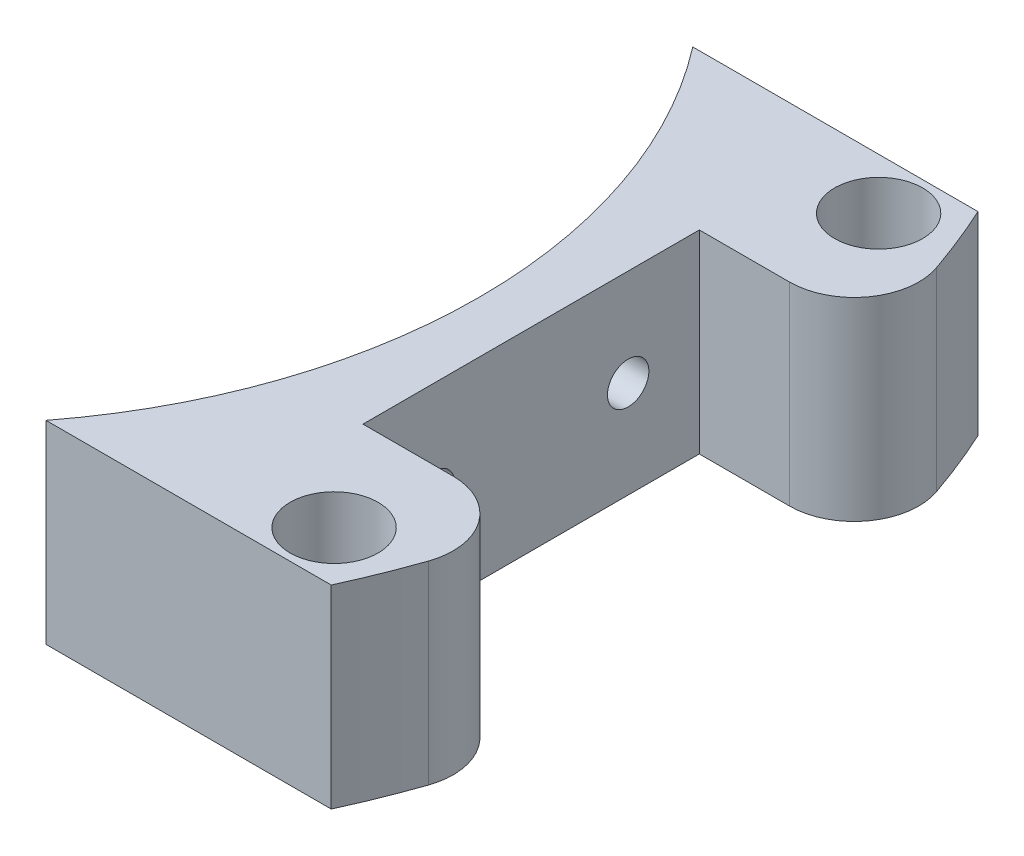
ISO-10303-21;
HEADER;
FILE_DESCRIPTION(('STEP AP214'),'2;1');
FILE_NAME('part.step','',(''),(''),'','','');
FILE_SCHEMA(('AUTOMOTIVE_DESIGN { 1 0 10303 214 1 1 1 1 }'));
ENDSEC;
DATA;
#1=APPLICATION_CONTEXT('core data for automotive mechanical design processes');
#2=APPLICATION_PROTOCOL_DEFINITION('international standard','automotive_design',2000,#1);
#3=PRODUCT_CONTEXT('',#1,'mechanical');
#4=PRODUCT('Part','Part','',(#3));
#5=PRODUCT_RELATED_PRODUCT_CATEGORY('part','',(#4));
#6=PRODUCT_DEFINITION_FORMATION('','',#4);
#7=PRODUCT_DEFINITION_CONTEXT('part definition',#1,'design');
#8=PRODUCT_DEFINITION('design','',#6,#7);
#9=PRODUCT_DEFINITION_SHAPE('','',#8);
#10=(LENGTH_UNIT() NAMED_UNIT(*) SI_UNIT(.MILLI.,.METRE.));
#11=(NAMED_UNIT(*) PLANE_ANGLE_UNIT() SI_UNIT($,.RADIAN.));
#12=(NAMED_UNIT(*) SI_UNIT($,.STERADIAN.) SOLID_ANGLE_UNIT());
#13=UNCERTAINTY_MEASURE_WITH_UNIT(LENGTH_MEASURE(1.E-05),#10,'distance_accuracy_value','');
#14=(GEOMETRIC_REPRESENTATION_CONTEXT(3) GLOBAL_UNCERTAINTY_ASSIGNED_CONTEXT((#13)) GLOBAL_UNIT_ASSIGNED_CONTEXT((#10,
#11,#12)) REPRESENTATION_CONTEXT('',''));
#15=CARTESIAN_POINT('',(0.,0.,0.));
#16=DIRECTION('',(0.,0.,1.));
#17=DIRECTION('',(1.,0.,0.));
#18=AXIS2_PLACEMENT_3D('',#15,#16,#17);
#19=CARTESIAN_POINT('',(-7.95357838980362,7.5,-68.2096969177125));
#20=DIRECTION('',(1.,0.,0.));
#21=DIRECTION('',(0.,0.,-1.));
#22=AXIS2_PLACEMENT_3D('',#19,#20,#21);
#23=CYLINDRICAL_SURFACE('',#22,1.6);
#24=CARTESIAN_POINT('',(4.55026799165255,7.5,-68.2096969177125));
#25=DIRECTION('',(1.,0.,0.));
#26=DIRECTION('',(0.,0.,-1.));
#27=AXIS2_PLACEMENT_3D('',#24,#25,#26);
#28=CIRCLE('',#27,1.6);
#29=CARTESIAN_POINT('',(4.55026799165255,7.5,-69.8096969177125));
#30=VERTEX_POINT('',#29);
#31=EDGE_CURVE('E537',#30,#30,#28,.T.);
#32=CARTESIAN_POINT('',(2.04642161019638,7.5,-68.2096969177125));
#33=DIRECTION('',(-1.,0.,0.));
#34=DIRECTION('',(0.,0.,1.));
#35=AXIS2_PLACEMENT_3D('',#32,#33,#34);
#36=CIRCLE('',#35,1.6);
#37=CARTESIAN_POINT('',(2.04642161019638,7.5,-69.8096969177125));
#38=VERTEX_POINT('',#37);
#39=EDGE_CURVE('E525',#38,#38,#36,.T.);
#40=CARTESIAN_POINT('',(4.55026799165255,7.5,-69.8096969177125));
#41=CARTESIAN_POINT('',(4.52418625851238,7.5,-69.8096969177125));
#42=CARTESIAN_POINT('',(4.49810452537221,7.5,-69.8096969177125));
#43=CARTESIAN_POINT('',(4.44594105909187,7.5,-69.8096969177125));
#44=CARTESIAN_POINT('',(4.4198593259517,7.5,-69.8096969177125));
#45=CARTESIAN_POINT('',(4.36769585967137,7.5,-69.8096969177125));
#46=CARTESIAN_POINT('',(4.3416141265312,7.5,-69.8096969177125));
#47=CARTESIAN_POINT('',(4.28945066025086,7.5,-69.8096969177125));
#48=CARTESIAN_POINT('',(4.26336892711069,7.5,-69.8096969177125));
#49=CARTESIAN_POINT('',(4.21120546083036,7.5,-69.8096969177125));
#50=CARTESIAN_POINT('',(4.18512372769019,7.5,-69.8096969177125));
#51=CARTESIAN_POINT('',(4.13296026140985,7.5,-69.8096969177125));
#52=CARTESIAN_POINT('',(4.10687852826968,7.5,-69.8096969177125));
#53=CARTESIAN_POINT('',(4.05471506198935,7.5,-69.8096969177125));
#54=CARTESIAN_POINT('',(4.02863332884918,7.5,-69.8096969177125));
#55=CARTESIAN_POINT('',(3.97646986256884,7.5,-69.8096969177125));
#56=CARTESIAN_POINT('',(3.95038812942867,7.5,-69.8096969177125));
#57=CARTESIAN_POINT('',(3.89822466314834,7.5,-69.8096969177125));
#58=CARTESIAN_POINT('',(3.87214293000817,7.5,-69.8096969177125));
#59=CARTESIAN_POINT('',(3.81997946372783,7.5,-69.8096969177125));
#60=CARTESIAN_POINT('',(3.79389773058766,7.5,-69.8096969177125));
#61=CARTESIAN_POINT('',(3.74173426430732,7.5,-69.8096969177125));
#62=CARTESIAN_POINT('',(3.71565253116716,7.5,-69.8096969177125));
#63=CARTESIAN_POINT('',(3.66348906488682,7.5,-69.8096969177125));
#64=CARTESIAN_POINT('',(3.63740733174665,7.5,-69.8096969177125));
#65=CARTESIAN_POINT('',(3.58524386546632,7.5,-69.8096969177125));
#66=CARTESIAN_POINT('',(3.55916213232615,7.5,-69.8096969177125));
#67=CARTESIAN_POINT('',(3.50699866604581,7.5,-69.8096969177125));
#68=CARTESIAN_POINT('',(3.48091693290564,7.5,-69.8096969177125));
#69=CARTESIAN_POINT('',(3.4287534666253,7.5,-69.8096969177125));
#70=CARTESIAN_POINT('',(3.40267173348514,7.5,-69.8096969177125));
#71=CARTESIAN_POINT('',(3.3505082672048,7.5,-69.8096969177125));
#72=CARTESIAN_POINT('',(3.32442653406463,7.5,-69.8096969177125));
#73=CARTESIAN_POINT('',(3.27226306778429,7.5,-69.8096969177125));
#74=CARTESIAN_POINT('',(3.24618133464413,7.5,-69.8096969177125));
#75=CARTESIAN_POINT('',(3.19401786836379,7.5,-69.8096969177125));
#76=CARTESIAN_POINT('',(3.16793613522362,7.5,-69.8096969177125));
#77=CARTESIAN_POINT('',(3.11577266894328,7.5,-69.8096969177125));
#78=CARTESIAN_POINT('',(3.08969093580311,7.5,-69.8096969177125));
#79=CARTESIAN_POINT('',(3.03752746952278,7.5,-69.8096969177125));
#80=CARTESIAN_POINT('',(3.01144573638261,7.5,-69.8096969177125));
#81=CARTESIAN_POINT('',(2.95928227010227,7.5,-69.8096969177125));
#82=CARTESIAN_POINT('',(2.9332005369621,7.5,-69.8096969177125));
#83=CARTESIAN_POINT('',(2.88103707068177,7.5,-69.8096969177125));
#84=CARTESIAN_POINT('',(2.8549553375416,7.5,-69.8096969177125));
#85=CARTESIAN_POINT('',(2.80279187126126,7.5,-69.8096969177125));
#86=CARTESIAN_POINT('',(2.77671013812109,7.5,-69.8096969177125));
#87=CARTESIAN_POINT('',(2.72454667184076,7.5,-69.8096969177125));
#88=CARTESIAN_POINT('',(2.69846493870059,7.5,-69.8096969177125));
#89=CARTESIAN_POINT('',(2.64630147242025,7.5,-69.8096969177125));
#90=CARTESIAN_POINT('',(2.62021973928008,7.5,-69.8096969177125));
#91=CARTESIAN_POINT('',(2.56805627299975,7.5,-69.8096969177125));
#92=CARTESIAN_POINT('',(2.54197453985958,7.5,-69.8096969177125));
#93=CARTESIAN_POINT('',(2.48981107357924,7.5,-69.8096969177125));
#94=CARTESIAN_POINT('',(2.46372934043907,7.5,-69.8096969177125));
#95=CARTESIAN_POINT('',(2.41156587415874,7.5,-69.8096969177125));
#96=CARTESIAN_POINT('',(2.38548414101857,7.5,-69.8096969177125));
#97=CARTESIAN_POINT('',(2.33332067473823,7.5,-69.8096969177125));
#98=CARTESIAN_POINT('',(2.30723894159806,7.5,-69.8096969177125));
#99=CARTESIAN_POINT('',(2.25507547531773,7.5,-69.8096969177125));
#100=CARTESIAN_POINT('',(2.22899374217756,7.5,-69.8096969177125));
#101=CARTESIAN_POINT('',(2.17683027589722,7.5,-69.8096969177125));
#102=CARTESIAN_POINT('',(2.15074854275705,7.5,-69.8096969177125));
#103=CARTESIAN_POINT('',(2.09858507647671,7.5,-69.8096969177125));
#104=CARTESIAN_POINT('',(2.07250334333655,7.5,-69.8096969177125));
#105=CARTESIAN_POINT('',(2.04642161019638,7.5,-69.8096969177125));
#106=B_SPLINE_CURVE_WITH_KNOTS('',3,(#40,#41,#42,#43,#44,#45,#46,#47,#48,#49,#50,#51,#52,#53,
#54,#55,#56,#57,#58,#59,#60,#61,#62,#63,#64,#65,#66,#67,#68,#69,#70,#71,#72,#73,#74,#75,#76,#77,
#78,#79,#80,#81,#82,#83,#84,#85,#86,#87,#88,#89,#90,#91,#92,#93,#94,#95,#96,#97,#98,#99,#100,
#101,#102,#103,#104,#105),.UNSPECIFIED.,.F.,.F.,(4,2,2,2,2,2,2,2,2,2,2,2,2,2,2,2,2,2,2,2,2,2,2,
2,2,2,2,2,2,2,2,2,4),(0.,0.0782451994205055,0.156490398841011,0.234735598261517,
0.312980797682022,0.391225997102526,0.469471196523031,0.547716395943537,0.625961595364042,
0.704206794784548,0.782451994205053,0.860697193625559,0.938942393046063,1.01718759246657,
1.09543279188707,1.17367799130758,1.25192319072808,1.33016839014859,1.4084135895691,
1.4866587889896,1.56490398841011,1.64314918783061,1.72139438725112,1.79963958667162,
1.87788478609213,1.95612998551263,2.03437518493314,2.11262038435364,2.19086558377415,
2.26911078319465,2.34735598261516,2.42560118203566,2.50384638145617),.UNSPECIFIED.);
#107=EDGE_CURVE('BSEAM45',#30,#38,#106,.T.);
#108=ORIENTED_EDGE('',*,*,#31,.T.);
#109=ORIENTED_EDGE('',*,*,#39,.T.);
#110=ORIENTED_EDGE('',*,*,#107,.T.);
#111=ORIENTED_EDGE('',*,*,#107,.F.);
#112=EDGE_LOOP('',(#108,#110,#109,#111));
#113=FACE_BOUND('',#112,.T.);
#114=ADVANCED_FACE('F45',(#113),#23,.F.);
#115=CARTESIAN_POINT('',(-7.95357838980362,7.5,-83.2096969177125));
#116=DIRECTION('',(1.,0.,0.));
#117=DIRECTION('',(0.,0.,-1.));
#118=AXIS2_PLACEMENT_3D('',#115,#116,#117);
#119=CYLINDRICAL_SURFACE('',#118,1.6);
#120=CARTESIAN_POINT('',(4.55026799165254,7.5,-83.2096969177125));
#121=DIRECTION('',(1.,0.,0.));
#122=DIRECTION('',(0.,0.,-1.));
#123=AXIS2_PLACEMENT_3D('',#120,#121,#122);
#124=CIRCLE('',#123,1.6);
#125=CARTESIAN_POINT('',(4.55026799165254,7.5,-84.8096969177125));
#126=VERTEX_POINT('',#125);
#127=EDGE_CURVE('E160',#126,#126,#124,.T.);
#128=CARTESIAN_POINT('',(2.04642161019638,7.5,-83.2096969177125));
#129=DIRECTION('',(-1.,0.,0.));
#130=DIRECTION('',(0.,0.,1.));
#131=AXIS2_PLACEMENT_3D('',#128,#129,#130);
#132=CIRCLE('',#131,1.6);
#133=CARTESIAN_POINT('',(2.04642161019638,7.5,-84.8096969177125));
#134=VERTEX_POINT('',#133);
#135=EDGE_CURVE('E518',#134,#134,#132,.T.);
#136=CARTESIAN_POINT('',(4.55026799165254,7.5,-84.8096969177125));
#137=CARTESIAN_POINT('',(4.52418625851238,7.5,-84.8096969177125));
#138=CARTESIAN_POINT('',(4.49810452537221,7.5,-84.8096969177125));
#139=CARTESIAN_POINT('',(4.44594105909187,7.5,-84.8096969177125));
#140=CARTESIAN_POINT('',(4.4198593259517,7.5,-84.8096969177125));
#141=CARTESIAN_POINT('',(4.36769585967137,7.5,-84.8096969177125));
#142=CARTESIAN_POINT('',(4.3416141265312,7.5,-84.8096969177125));
#143=CARTESIAN_POINT('',(4.28945066025086,7.5,-84.8096969177125));
#144=CARTESIAN_POINT('',(4.26336892711069,7.5,-84.8096969177125));
#145=CARTESIAN_POINT('',(4.21120546083036,7.5,-84.8096969177125));
#146=CARTESIAN_POINT('',(4.18512372769019,7.5,-84.8096969177125));
#147=CARTESIAN_POINT('',(4.13296026140985,7.5,-84.8096969177125));
#148=CARTESIAN_POINT('',(4.10687852826968,7.5,-84.8096969177125));
#149=CARTESIAN_POINT('',(4.05471506198935,7.5,-84.8096969177125));
#150=CARTESIAN_POINT('',(4.02863332884918,7.5,-84.8096969177125));
#151=CARTESIAN_POINT('',(3.97646986256884,7.5,-84.8096969177125));
#152=CARTESIAN_POINT('',(3.95038812942867,7.5,-84.8096969177125));
#153=CARTESIAN_POINT('',(3.89822466314834,7.5,-84.8096969177125));
#154=CARTESIAN_POINT('',(3.87214293000817,7.5,-84.8096969177125));
#155=CARTESIAN_POINT('',(3.81997946372783,7.5,-84.8096969177125));
#156=CARTESIAN_POINT('',(3.79389773058766,7.5,-84.8096969177125));
#157=CARTESIAN_POINT('',(3.74173426430732,7.5,-84.8096969177125));
#158=CARTESIAN_POINT('',(3.71565253116716,7.5,-84.8096969177125));
#159=CARTESIAN_POINT('',(3.66348906488682,7.5,-84.8096969177125));
#160=CARTESIAN_POINT('',(3.63740733174665,7.5,-84.8096969177125));
#161=CARTESIAN_POINT('',(3.58524386546631,7.5,-84.8096969177125));
#162=CARTESIAN_POINT('',(3.55916213232615,7.5,-84.8096969177125));
#163=CARTESIAN_POINT('',(3.50699866604581,7.5,-84.8096969177125));
#164=CARTESIAN_POINT('',(3.48091693290564,7.5,-84.8096969177125));
#165=CARTESIAN_POINT('',(3.4287534666253,7.5,-84.8096969177125));
#166=CARTESIAN_POINT('',(3.40267173348514,7.5,-84.8096969177125));
#167=CARTESIAN_POINT('',(3.3505082672048,7.5,-84.8096969177125));
#168=CARTESIAN_POINT('',(3.32442653406463,7.5,-84.8096969177125));
#169=CARTESIAN_POINT('',(3.27226306778429,7.5,-84.8096969177125));
#170=CARTESIAN_POINT('',(3.24618133464413,7.5,-84.8096969177125));
#171=CARTESIAN_POINT('',(3.19401786836379,7.5,-84.8096969177125));
#172=CARTESIAN_POINT('',(3.16793613522362,7.5,-84.8096969177125));
#173=CARTESIAN_POINT('',(3.11577266894328,7.5,-84.8096969177125));
#174=CARTESIAN_POINT('',(3.08969093580312,7.5,-84.8096969177125));
#175=CARTESIAN_POINT('',(3.03752746952278,7.5,-84.8096969177125));
#176=CARTESIAN_POINT('',(3.01144573638261,7.5,-84.8096969177125));
#177=CARTESIAN_POINT('',(2.95928227010227,7.5,-84.8096969177125));
#178=CARTESIAN_POINT('',(2.9332005369621,7.5,-84.8096969177125));
#179=CARTESIAN_POINT('',(2.88103707068177,7.5,-84.8096969177125));
#180=CARTESIAN_POINT('',(2.8549553375416,7.5,-84.8096969177125));
#181=CARTESIAN_POINT('',(2.80279187126126,7.5,-84.8096969177125));
#182=CARTESIAN_POINT('',(2.77671013812109,7.5,-84.8096969177125));
#183=CARTESIAN_POINT('',(2.72454667184076,7.5,-84.8096969177125));
#184=CARTESIAN_POINT('',(2.69846493870059,7.5,-84.8096969177125));
#185=CARTESIAN_POINT('',(2.64630147242025,7.5,-84.8096969177125));
#186=CARTESIAN_POINT('',(2.62021973928008,7.5,-84.8096969177125));
#187=CARTESIAN_POINT('',(2.56805627299975,7.5,-84.8096969177125));
#188=CARTESIAN_POINT('',(2.54197453985958,7.5,-84.8096969177125));
#189=CARTESIAN_POINT('',(2.48981107357924,7.5,-84.8096969177125));
#190=CARTESIAN_POINT('',(2.46372934043907,7.5,-84.8096969177125));
#191=CARTESIAN_POINT('',(2.41156587415874,7.5,-84.8096969177125));
#192=CARTESIAN_POINT('',(2.38548414101857,7.5,-84.8096969177125));
#193=CARTESIAN_POINT('',(2.33332067473823,7.5,-84.8096969177125));
#194=CARTESIAN_POINT('',(2.30723894159806,7.5,-84.8096969177125));
#195=CARTESIAN_POINT('',(2.25507547531773,7.5,-84.8096969177125));
#196=CARTESIAN_POINT('',(2.22899374217756,7.5,-84.8096969177125));
#197=CARTESIAN_POINT('',(2.17683027589722,7.5,-84.8096969177125));
#198=CARTESIAN_POINT('',(2.15074854275705,7.5,-84.8096969177125));
#199=CARTESIAN_POINT('',(2.09858507647672,7.5,-84.8096969177125));
#200=CARTESIAN_POINT('',(2.07250334333655,7.5,-84.8096969177125));
#201=CARTESIAN_POINT('',(2.04642161019638,7.5,-84.8096969177125));
#202=B_SPLINE_CURVE_WITH_KNOTS('',3,(#136,#137,#138,#139,#140,#141,#142,#143,#144,#145,#146,
#147,#148,#149,#150,#151,#152,#153,#154,#155,#156,#157,#158,#159,#160,#161,#162,#163,#164,#165,
#166,#167,#168,#169,#170,#171,#172,#173,#174,#175,#176,#177,#178,#179,#180,#181,#182,#183,#184,
#185,#186,#187,#188,#189,#190,#191,#192,#193,#194,#195,#196,#197,#198,#199,#200,#201),
.UNSPECIFIED.,.F.,.F.,(4,2,2,2,2,2,2,2,2,2,2,2,2,2,2,2,2,2,2,2,2,2,2,2,2,2,2,2,2,2,2,2,4),(0.,
0.0782451994205055,0.156490398841011,0.234735598261515,0.31298079768202,0.391225997102526,
0.469471196523031,0.547716395943537,0.625961595364041,0.704206794784546,0.782451994205052,
0.860697193625557,0.938942393046063,1.01718759246657,1.09543279188707,1.17367799130758,
1.25192319072808,1.33016839014859,1.40841358956909,1.4866587889896,1.5649039884101,
1.64314918783061,1.72139438725111,1.79963958667162,1.87788478609213,1.95612998551263,
2.03437518493313,2.11262038435364,2.19086558377415,2.26911078319465,2.34735598261515,
2.42560118203566,2.50384638145617),.UNSPECIFIED.);
#203=EDGE_CURVE('BSEAM265',#126,#134,#202,.T.);
#204=ORIENTED_EDGE('',*,*,#127,.T.);
#205=ORIENTED_EDGE('',*,*,#135,.T.);
#206=ORIENTED_EDGE('',*,*,#203,.T.);
#207=ORIENTED_EDGE('',*,*,#203,.F.);
#208=EDGE_LOOP('',(#204,#206,#205,#207));
#209=FACE_BOUND('',#208,.T.);
#210=ADVANCED_FACE('F265',(#209),#119,.F.);
#211=CARTESIAN_POINT('',(-40.4497320083475,15.,-75.7096969177125));
#212=DIRECTION('',(0.,-1.,0.));
#213=DIRECTION('',(0.,0.,-1.));
#214=AXIS2_PLACEMENT_3D('',#211,#212,#213);
#215=CYLINDRICAL_SURFACE('',#214,60.);
#216=CARTESIAN_POINT('',(-40.4497320083475,0.,-75.7096969177125));
#217=DIRECTION('',(0.,1.,0.));
#218=DIRECTION('',(0.,0.,1.));
#219=AXIS2_PLACEMENT_3D('',#216,#217,#218);
#220=CIRCLE('',#219,60.);
#221=CARTESIAN_POINT('',(14.0938285648311,0.,-50.7096969177125));
#222=VERTEX_POINT('',#221);
#223=CARTESIAN_POINT('',(16.2460634542836,0.,-56.0733332813489));
#224=VERTEX_POINT('',#223);
#225=EDGE_CURVE('E203',#222,#224,#220,.T.);
#226=ORIENTED_EDGE('',*,*,#225,.T.);
#227=DIRECTION('',(0.,-1.,0.));
#228=VECTOR('',#227,1.);
#229=CARTESIAN_POINT('',(16.2460634542836,15.,-56.0733332813489));
#230=LINE('',#229,#228);
#231=CARTESIAN_POINT('',(16.2460634542836,15.,-56.0733332813489));
#232=VERTEX_POINT('',#231);
#233=EDGE_CURVE('E54',#224,#232,#230,.F.);
#234=ORIENTED_EDGE('',*,*,#233,.T.);
#235=CARTESIAN_POINT('',(-40.4497320083475,15.,-75.7096969177125));
#236=DIRECTION('',(0.,1.,0.));
#237=DIRECTION('',(0.,0.,1.));
#238=AXIS2_PLACEMENT_3D('',#235,#236,#237);
#239=CIRCLE('',#238,60.);
#240=CARTESIAN_POINT('',(14.0938285648311,15.,-50.7096969177125));
#241=VERTEX_POINT('',#240);
#242=EDGE_CURVE('E178',#241,#232,#239,.T.);
#243=ORIENTED_EDGE('',*,*,#242,.F.);
#244=DIRECTION('',(0.,-1.,0.));
#245=VECTOR('',#244,1.);
#246=CARTESIAN_POINT('',(14.0938285648311,15.,-50.7096969177125));
#247=LINE('',#246,#245);
#248=EDGE_CURVE('E226',#241,#222,#247,.T.);
#249=ORIENTED_EDGE('',*,*,#248,.T.);
#250=EDGE_LOOP('',(#226,#234,#243,#249));
#251=FACE_BOUND('',#250,.T.);
#252=ADVANCED_FACE('F268',(#251),#215,.T.);
#253=CARTESIAN_POINT('',(0.,15.,-50.7096969177125));
#254=DIRECTION('',(0.,0.,-1.));
#255=DIRECTION('',(-1.,0.,0.));
#256=AXIS2_PLACEMENT_3D('',#253,#254,#255);
#257=PLANE('',#256);
#258=DIRECTION('',(1.,0.,0.));
#259=VECTOR('',#258,1.);
#260=CARTESIAN_POINT('',(0.,0.,-50.7096969177125));
#261=LINE('',#260,#259);
#262=CARTESIAN_POINT('',(-7.95357838980362,0.,-50.7096969177125));
#263=VERTEX_POINT('',#262);
#264=EDGE_CURVE('E198',#263,#222,#261,.T.);
#265=ORIENTED_EDGE('',*,*,#264,.T.);
#266=ORIENTED_EDGE('',*,*,#248,.F.);
#267=DIRECTION('',(1.,0.,0.));
#268=VECTOR('',#267,1.);
#269=CARTESIAN_POINT('',(0.,15.,-50.7096969177125));
#270=LINE('',#269,#268);
#271=CARTESIAN_POINT('',(-7.95357838980362,15.,-50.7096969177125));
#272=VERTEX_POINT('',#271);
#273=EDGE_CURVE('E172',#272,#241,#270,.T.);
#274=ORIENTED_EDGE('',*,*,#273,.F.);
#275=DIRECTION('',(0.,-1.,0.));
#276=VECTOR('',#275,1.);
#277=CARTESIAN_POINT('',(-7.95357838980362,15.,-50.7096969177125));
#278=LINE('',#277,#276);
#279=EDGE_CURVE('E194',#272,#263,#278,.T.);
#280=ORIENTED_EDGE('',*,*,#279,.T.);
#281=EDGE_LOOP('',(#265,#266,#274,#280));
#282=FACE_BOUND('',#281,.T.);
#283=ADVANCED_FACE('F307',(#282),#257,.F.);
#284=CARTESIAN_POINT('',(16.2460634542836,15.,-95.3460605540761));
#285=VERTEX_POINT('',#284);
#286=CARTESIAN_POINT('',(14.0938285648311,15.,-100.709696917713));
#287=VERTEX_POINT('',#286);
#288=EDGE_CURVE('E177',#285,#287,#239,.T.);
#289=ORIENTED_EDGE('',*,*,#288,.F.);
#290=DIRECTION('',(0.,-1.,0.));
#291=VECTOR('',#290,1.);
#292=CARTESIAN_POINT('',(16.2460634542836,15.,-95.3460605540761));
#293=LINE('',#292,#291);
#294=CARTESIAN_POINT('',(16.2460634542836,0.,-95.3460605540761));
#295=VERTEX_POINT('',#294);
#296=EDGE_CURVE('E316',#285,#295,#293,.T.);
#297=ORIENTED_EDGE('',*,*,#296,.T.);
#298=CARTESIAN_POINT('',(14.0938285648311,0.,-100.709696917713));
#299=VERTEX_POINT('',#298);
#300=EDGE_CURVE('E202',#295,#299,#220,.T.);
#301=ORIENTED_EDGE('',*,*,#300,.T.);
#302=DIRECTION('',(0.,-1.,0.));
#303=VECTOR('',#302,1.);
#304=CARTESIAN_POINT('',(14.0938285648311,15.,-100.709696917713));
#305=LINE('',#304,#303);
#306=EDGE_CURVE('E222',#287,#299,#305,.T.);
#307=ORIENTED_EDGE('',*,*,#306,.F.);
#308=EDGE_LOOP('',(#289,#297,#301,#307));
#309=FACE_BOUND('',#308,.T.);
#310=ADVANCED_FACE('F350',(#309),#215,.T.);
#311=CARTESIAN_POINT('',(0.,15.,-100.709696917713));
#312=DIRECTION('',(0.,0.,-1.));
#313=DIRECTION('',(-1.,0.,0.));
#314=AXIS2_PLACEMENT_3D('',#311,#312,#313);
#315=PLANE('',#314);
#316=DIRECTION('',(1.,0.,0.));
#317=VECTOR('',#316,1.);
#318=CARTESIAN_POINT('',(0.,0.,-100.709696917713));
#319=LINE('',#318,#317);
#320=CARTESIAN_POINT('',(-7.95357838980362,0.,-100.709696917713));
#321=VERTEX_POINT('',#320);
#322=EDGE_CURVE('E206',#321,#299,#319,.T.);
#323=ORIENTED_EDGE('',*,*,#322,.F.);
#324=DIRECTION('',(0.,-1.,0.));
#325=VECTOR('',#324,1.);
#326=CARTESIAN_POINT('',(-7.95357838980362,15.,-100.709696917713));
#327=LINE('',#326,#325);
#328=CARTESIAN_POINT('',(-7.95357838980362,15.,-100.709696917713));
#329=VERTEX_POINT('',#328);
#330=EDGE_CURVE('E219',#329,#321,#327,.T.);
#331=ORIENTED_EDGE('',*,*,#330,.F.);
#332=DIRECTION('',(1.,0.,0.));
#333=VECTOR('',#332,1.);
#334=CARTESIAN_POINT('',(0.,15.,-100.709696917713));
#335=LINE('',#334,#333);
#336=EDGE_CURVE('E182',#329,#287,#335,.T.);
#337=ORIENTED_EDGE('',*,*,#336,.T.);
#338=ORIENTED_EDGE('',*,*,#306,.T.);
#339=EDGE_LOOP('',(#323,#331,#337,#338));
#340=FACE_BOUND('',#339,.T.);
#341=ADVANCED_FACE('F303',(#340),#315,.T.);
#342=CARTESIAN_POINT('',(-40.4497320083475,15.,-75.7096969177125));
#343=DIRECTION('',(0.,-1.,0.));
#344=DIRECTION('',(0.,0.,-1.));
#345=AXIS2_PLACEMENT_3D('',#342,#343,#344);
#346=CYLINDRICAL_SURFACE('',#345,41.);
#347=CARTESIAN_POINT('',(0.354679517858884,7.5,-79.7096969177125));
#348=CARTESIAN_POINT('',(0.354679923211773,7.69573040612567,-79.7097054268311));
#349=CARTESIAN_POINT('',(0.3530749825422,7.89159377568724,-79.7261709847604));
#350=CARTESIAN_POINT('',(0.346579374621291,8.27791269743719,-79.791610376265));
#351=CARTESIAN_POINT('',(0.341685000840673,8.46836189634504,-79.8406208807005));
#352=CARTESIAN_POINT('',(0.328405270445635,8.83821089703764,-79.9697093316831));
#353=CARTESIAN_POINT('',(0.320021564498353,9.01761587740801,-80.0497725871648));
#354=CARTESIAN_POINT('',(0.299477338153755,9.3603287133971,-80.2385943896633));
#355=CARTESIAN_POINT('',(0.287317720526969,9.5236404044266,-80.3473460767214));
#356=CARTESIAN_POINT('',(0.258906467776436,9.82975178565088,-80.5904443017862));
#357=CARTESIAN_POINT('',(0.242651641950646,9.97253534487045,-80.7248107771027));
#358=CARTESIAN_POINT('',(0.205818889250409,10.233485556736,-81.0151230069587));
#359=CARTESIAN_POINT('',(0.185240786069452,10.3516512050536,-81.1710696414648));
#360=CARTESIAN_POINT('',(0.139589463976861,10.5605960193467,-81.5006137811279));
#361=CARTESIAN_POINT('',(0.114498933887224,10.6512659718321,-81.6742781061345));
#362=CARTESIAN_POINT('',(0.0600212948696497,10.8022737655296,-82.033690853151));
#363=CARTESIAN_POINT('',(0.0306340062559006,10.8626103377639,-82.2194397803455));
#364=CARTESIAN_POINT('',(-0.0323391960213361,10.9520153060868,-82.5996786834472));
#365=CARTESIAN_POINT('',(-0.0659649174260195,10.9807581351851,-82.7942385466744));
#366=CARTESIAN_POINT('',(-0.136439409792408,11.0053800426376,-83.1848447591623));
#367=CARTESIAN_POINT('',(-0.173288469900954,11.0012561697162,-83.3808912403352));
#368=CARTESIAN_POINT('',(-0.24978921487309,10.9601807321859,-83.7722641610184));
#369=CARTESIAN_POINT('',(-0.28947641298761,10.9227028702593,-83.9675284398274));
#370=CARTESIAN_POINT('',(-0.369755772401301,10.8153809970264,-84.3487643911925));
#371=CARTESIAN_POINT('',(-0.410348026654412,10.7455336464949,-84.5347351028343));
#372=CARTESIAN_POINT('',(-0.491364142438813,10.5742742871092,-84.8946477798246));
#373=CARTESIAN_POINT('',(-0.531779132666818,10.4724680887702,-85.0684044017748));
#374=CARTESIAN_POINT('',(-0.610077719955702,10.2402729698756,-85.3963064294897));
#375=CARTESIAN_POINT('',(-0.647961278371345,10.109883613095,-85.5504515358943));
#376=CARTESIAN_POINT('',(-0.719116277065583,9.82460764301622,-85.8338991942233));
#377=CARTESIAN_POINT('',(-0.752408484695852,9.66983860750094,-85.9633147011948));
#378=CARTESIAN_POINT('',(-0.812733747526869,9.33954419022112,-86.1940970487541));
#379=CARTESIAN_POINT('',(-0.839767816270469,9.16402217649123,-86.2954684317741));
#380=CARTESIAN_POINT('',(-0.885305949781514,8.8021856244904,-86.4644017786097));
#381=CARTESIAN_POINT('',(-0.904019620590785,8.61628758868092,-86.5327987045176));
#382=CARTESIAN_POINT('',(-0.932782209567152,8.23500232541535,-86.6373525449817));
#383=CARTESIAN_POINT('',(-0.942833044573983,8.03961720729398,-86.6735165918196));
#384=CARTESIAN_POINT('',(-0.953441883237556,7.65157756913561,-86.7116714329496));
#385=CARTESIAN_POINT('',(-0.954291407755822,7.45903359222422,-86.7147116916077));
#386=CARTESIAN_POINT('',(-0.94720219086396,7.07622149685476,-86.6892374030224));
#387=CARTESIAN_POINT('',(-0.939264164419684,6.88595319451807,-86.6607254229076));
#388=CARTESIAN_POINT('',(-0.915223062400894,6.51511442392416,-86.5736092826824));
#389=CARTESIAN_POINT('',(-0.899206424474363,6.3344632222848,-86.5153236057215));
#390=CARTESIAN_POINT('',(-0.859990479038479,5.9855892520547,-86.3707448976627));
#391=CARTESIAN_POINT('',(-0.836790587853997,5.81736749479458,-86.2844495906154));
#392=CARTESIAN_POINT('',(-0.783971020487291,5.49456844201397,-86.0845825895897));
#393=CARTESIAN_POINT('',(-0.754237034552506,5.3403136885781,-85.9705207245178));
#394=CARTESIAN_POINT('',(-0.690164059239122,5.05296510411669,-85.7193683175621));
#395=CARTESIAN_POINT('',(-0.655824304830826,4.91987479660293,-85.582273948964));
#396=CARTESIAN_POINT('',(-0.582986844167205,4.67406706947198,-85.2839809675382));
#397=CARTESIAN_POINT('',(-0.544390048849873,4.56215577531294,-85.1221419800958));
#398=CARTESIAN_POINT('',(-0.46575672696553,4.36705827099465,-84.7822996179304));
#399=CARTESIAN_POINT('',(-0.425720006882691,4.28387593785496,-84.6042940655939));
#400=CARTESIAN_POINT('',(-0.344940330898149,4.14688174541276,-84.2327585243033));
#401=CARTESIAN_POINT('',(-0.304201428290656,4.09376290720614,-84.0389716208832));
#402=CARTESIAN_POINT('',(-0.224439229265522,4.02137768063248,-83.6448236045382));
#403=CARTESIAN_POINT('',(-0.185415964201239,4.00211191068138,-83.444462371584));
#404=CARTESIAN_POINT('',(-0.110331750806117,3.99821718938717,-83.0428084993084));
#405=CARTESIAN_POINT('',(-0.074271150767519,4.0135923044204,-82.8415157534081));
#406=CARTESIAN_POINT('',(-0.00605631096722899,4.07886522385814,-82.4439217322975));
#407=CARTESIAN_POINT('',(0.0260982290673611,4.12876037260656,-82.247620074323));
#408=CARTESIAN_POINT('',(0.0854648740642685,4.26093386349668,-81.8687612746825));
#409=CARTESIAN_POINT('',(0.11274283746725,4.34272409535248,-81.6860442026073));
#410=CARTESIAN_POINT('',(0.162673141575871,4.53656528168169,-81.3367481736201));
#411=CARTESIAN_POINT('',(0.185326041328885,4.64861257507265,-81.170167267555));
#412=CARTESIAN_POINT('',(0.225710676984878,4.89790468185967,-80.8606578726223));
#413=CARTESIAN_POINT('',(0.243512647380676,5.03473609449505,-80.7174054282746));
#414=CARTESIAN_POINT('',(0.274856014956063,5.33089924887446,-80.4557836621204));
#415=CARTESIAN_POINT('',(0.28839661836357,5.49023517457375,-80.3374189775604));
#416=CARTESIAN_POINT('',(0.311420774558331,5.82544108920337,-80.1300204925962));
#417=CARTESIAN_POINT('',(0.320935863792207,6.00116887323608,-80.0407600016816));
#418=CARTESIAN_POINT('',(0.336363112503396,6.3651003151523,-79.8929987716228));
#419=CARTESIAN_POINT('',(0.342279409271173,6.55328936998366,-79.834462721309));
#420=CARTESIAN_POINT('',(0.349255126696859,6.86881989841966,-79.7647377203937));
#421=CARTESIAN_POINT('',(0.351292288627216,6.99413842883607,-79.7441250461151));
#422=CARTESIAN_POINT('',(0.354004352194883,7.24628601464617,-79.7166018929898));
#423=CARTESIAN_POINT('',(0.354679255083292,7.3731150686525,-79.7096914015592));
#424=CARTESIAN_POINT('',(0.354679517858884,7.5,-79.7096969177125));
#425=B_SPLINE_CURVE_WITH_KNOTS('',3,(#347,#348,#349,#350,#351,#352,#353,#354,#355,#356,#357,
#358,#359,#360,#361,#362,#363,#364,#365,#366,#367,#368,#369,#370,#371,#372,#373,#374,#375,#376,
#377,#378,#379,#380,#381,#382,#383,#384,#385,#386,#387,#388,#389,#390,#391,#392,#393,#394,#395,
#396,#397,#398,#399,#400,#401,#402,#403,#404,#405,#406,#407,#408,#409,#410,#411,#412,#413,#414,
#415,#416,#417,#418,#419,#420,#421,#422,#423,#424),.UNSPECIFIED.,.T.,.F.,(4,2,2,2,2,2,2,2,2,2,2,
2,2,2,2,2,2,2,2,2,2,2,2,2,2,2,2,2,2,2,2,2,2,2,2,2,2,2,4),(0.,0.586728798766341,1.17411983373797,
1.7612333121542,2.34820652744096,2.93563849353365,3.52309442019648,4.11285406003006,
4.70263837003395,5.29844490737565,5.89430494594947,6.49973719824874,7.10523192063531,
7.7185096298182,8.33179669925682,8.94221180190528,9.55252797492047,10.1464515622645,
10.7402436974094,11.3151658087991,11.8900411472631,12.4588920615264,13.027789209897,
13.6075682733325,14.1874437590653,14.7862336894042,15.3851043958626,15.997270050038,
16.609446886924,17.2216955889224,17.8338971953342,18.4370760094743,19.0401818720938,
19.63402546949,20.2279796177614,20.8171903850257,21.4057224896041,21.7860778630842,
22.1664328872457),.UNSPECIFIED.);
#426=CARTESIAN_POINT('',(0.354679517858884,7.5,-79.7096969177125));
#427=VERTEX_POINT('',#426);
#428=EDGE_CURVE('E240',#427,#427,#425,.T.);
#429=ORIENTED_EDGE('',*,*,#428,.F.);
#430=EDGE_LOOP('',(#429));
#431=FACE_BOUND('',#430,.T.);
#432=CARTESIAN_POINT('',(-0.952896692084454,7.5,-64.7096969177125));
#433=CARTESIAN_POINT('',(-0.952892877323954,7.69174493134551,-64.709706098088));
#434=CARTESIAN_POINT('',(-0.948480427385539,7.88362334396103,-64.7255161088227));
#435=CARTESIAN_POINT('',(-0.931089349392404,8.26196499823756,-64.7882548364049));
#436=CARTESIAN_POINT('',(-0.91810085471677,8.44842174407669,-64.8352193964216));
#437=CARTESIAN_POINT('',(-0.884369390380928,8.81027938827759,-64.958597536184));
#438=CARTESIAN_POINT('',(-0.863637212739314,8.98569527805765,-65.0349701358422));
#439=CARTESIAN_POINT('',(-0.815608516369863,9.32104994606107,-65.214704417535));
#440=CARTESIAN_POINT('',(-0.788312848324138,9.48099072622112,-65.3180626021656));
#441=CARTESIAN_POINT('',(-0.728034968889828,9.78428210067552,-65.550884379051));
#442=CARTESIAN_POINT('',(-0.69495558581466,9.92726469648194,-65.6808018027445));
#443=CARTESIAN_POINT('',(-0.625124534364025,10.1895917906699,-65.9617960672202));
#444=CARTESIAN_POINT('',(-0.588372187259541,10.3089319079486,-66.1128768208653));
#445=CARTESIAN_POINT('',(-0.511648246168632,10.5244970546168,-66.4372608556418));
#446=CARTESIAN_POINT('',(-0.471611425300113,10.6198656359826,-66.6111183244671));
#447=CARTESIAN_POINT('',(-0.391115048632683,10.7799360917315,-66.9723386555479));
#448=CARTESIAN_POINT('',(-0.350655447645279,10.8446346529897,-67.1597029743615));
#449=CARTESIAN_POINT('',(-0.270234909186398,10.9423344228573,-67.5459055494178));
#450=CARTESIAN_POINT('',(-0.230291756045583,10.9748223706026,-67.7448777074799));
#451=CARTESIAN_POINT('',(-0.152942111878385,11.005192462537,-68.1459398045685));
#452=CARTESIAN_POINT('',(-0.115535559913191,11.0030754383651,-68.3480296685527));
#453=CARTESIAN_POINT('',(-0.0445371084067099,10.964117961118,-68.7482818851168));
#454=CARTESIAN_POINT('',(-0.0109239250672946,10.9274832688238,-68.9464604115114));
#455=CARTESIAN_POINT('',(0.0520202991617972,10.8205236334258,-69.3342240646239));
#456=CARTESIAN_POINT('',(0.0813517154404154,10.750201646055,-69.5238099436659));
#457=CARTESIAN_POINT('',(0.134907869636699,10.5790743341379,-69.8856133672601));
#458=CARTESIAN_POINT('',(0.159208077806902,10.4787847649989,-70.0580637105196));
#459=CARTESIAN_POINT('',(0.203214695518243,10.2500532522637,-70.3838187791185));
#460=CARTESIAN_POINT('',(0.222921449713402,10.1216134222294,-70.5371249404747));
#461=CARTESIAN_POINT('',(0.257650946481887,9.84211980152529,-70.8179916913402));
#462=CARTESIAN_POINT('',(0.272733090720487,9.69139319480788,-70.9458706520407));
#463=CARTESIAN_POINT('',(0.298840443406549,9.37035087161383,-71.1745963401853));
#464=CARTESIAN_POINT('',(0.309865799866562,9.20003587012054,-71.2754440538323));
#465=CARTESIAN_POINT('',(0.32811652901501,8.84582857218019,-71.4465453832875));
#466=CARTESIAN_POINT('',(0.335365543131457,8.66202917031883,-71.5169888535876));
#467=CARTESIAN_POINT('',(0.346438819625658,8.28513763733621,-71.6261347074586));
#468=CARTESIAN_POINT('',(0.350263122177215,8.09204561525065,-71.6648374633655));
#469=CARTESIAN_POINT('',(0.35464936750695,7.70242423109014,-71.7093257991549));
#470=CARTESIAN_POINT('',(0.355217180908742,7.50590169554368,-71.7151706131925));
#471=CARTESIAN_POINT('',(0.353132358885642,7.11466164184662,-71.6939319299737));
#472=CARTESIAN_POINT('',(0.350479736198978,6.91994411655946,-71.6668485629626));
#473=CARTESIAN_POINT('',(0.341836400945138,6.53789125643067,-71.58055583672));
#474=CARTESIAN_POINT('',(0.335846517642287,6.35055410004393,-71.5213544584777));
#475=CARTESIAN_POINT('',(0.320291979492545,5.98852372933732,-71.3725658617117));
#476=CARTESIAN_POINT('',(0.310727345117182,5.81383044261664,-71.2829788171978));
#477=CARTESIAN_POINT('',(0.287716426958222,5.48194650226781,-71.076005203195));
#478=CARTESIAN_POINT('',(0.274268379908774,5.32476384437882,-70.9586060099424));
#479=CARTESIAN_POINT('',(0.243201611323087,5.03239678474584,-70.6994940184517));
#480=CARTESIAN_POINT('',(0.225582894459801,4.89721235835462,-70.5577812474553));
#481=CARTESIAN_POINT('',(0.185929397235888,4.65224090942814,-70.2538262171192));
#482=CARTESIAN_POINT('',(0.163883506841209,4.54251931006428,-70.0915326955534));
#483=CARTESIAN_POINT('',(0.115386964042315,4.35182987063938,-69.7514598419901));
#484=CARTESIAN_POINT('',(0.088936195230578,4.27086279064989,-69.5736801007982));
#485=CARTESIAN_POINT('',(0.0316331121354392,4.13918069376275,-69.2063228567158));
#486=CARTESIAN_POINT('',(0.000748025091676343,4.08870696384071,-69.0166640343704));
#487=CARTESIAN_POINT('',(-0.0647441381410587,4.02011239035838,-68.6322131513435));
#488=CARTESIAN_POINT('',(-0.0993515086012985,4.00199410670751,-68.4374206857337));
#489=CARTESIAN_POINT('',(-0.171993895701,3.99829107878431,-68.0452232645191));
#490=CARTESIAN_POINT('',(-0.210071612426338,4.01318564267347,-67.8478217310124));
#491=CARTESIAN_POINT('',(-0.288058197401691,4.07584773063519,-67.4586748552473));
#492=CARTESIAN_POINT('',(-0.327967260025729,4.12361875169162,-67.2669301169504));
#493=CARTESIAN_POINT('',(-0.408823475111469,4.25162438520011,-66.8913565247051));
#494=CARTESIAN_POINT('',(-0.449777126856355,4.33235116512944,-66.7076966389257));
#495=CARTESIAN_POINT('',(-0.530410650438798,4.52408480022465,-66.3566083821262));
#496=CARTESIAN_POINT('',(-0.570090490055904,4.63509242065604,-66.1891804214685));
#497=CARTESIAN_POINT('',(-0.646425819539752,4.88482404110941,-65.8749080668033));
#498=CARTESIAN_POINT('',(-0.683073332311413,5.0236180548439,-65.7281172959974));
#499=CARTESIAN_POINT('',(-0.751321649673219,5.3251243180143,-65.4600431780014));
#500=CARTESIAN_POINT('',(-0.782921752231469,5.48783988860712,-65.3387633783275));
#501=CARTESIAN_POINT('',(-0.838681296667503,5.82923715893395,-65.1278081313769));
#502=CARTESIAN_POINT('',(-0.862974867979298,6.00754185602583,-65.0375579593846));
#503=CARTESIAN_POINT('',(-0.903435003696632,6.37755450427769,-64.8885871342378));
#504=CARTESIAN_POINT('',(-0.919613254265847,6.5692427268943,-64.8298211351265));
#505=CARTESIAN_POINT('',(-0.938389708579255,6.88527186170719,-64.7618889260164));
#506=CARTESIAN_POINT('',(-0.943815513211365,7.00731392026006,-64.7423478110552));
#507=CARTESIAN_POINT('',(-0.951070190871786,7.25288552645361,-64.7162490052427));
#508=CARTESIAN_POINT('',(-0.952899150804107,7.37641503808312,-64.7096910007042));
#509=CARTESIAN_POINT('',(-0.952896692084454,7.5,-64.7096969177125));
#510=B_SPLINE_CURVE_WITH_KNOTS('',3,(#432,#433,#434,#435,#436,#437,#438,#439,#440,#441,#442,
#443,#444,#445,#446,#447,#448,#449,#450,#451,#452,#453,#454,#455,#456,#457,#458,#459,#460,#461,
#462,#463,#464,#465,#466,#467,#468,#469,#470,#471,#472,#473,#474,#475,#476,#477,#478,#479,#480,
#481,#482,#483,#484,#485,#486,#487,#488,#489,#490,#491,#492,#493,#494,#495,#496,#497,#498,#499,
#500,#501,#502,#503,#504,#505,#506,#507,#508,#509),.UNSPECIFIED.,.T.,.F.,(4,2,2,2,2,2,2,2,2,2,2,
2,2,2,2,2,2,2,2,2,2,2,2,2,2,2,2,2,2,2,2,2,2,2,2,2,2,2,4),(0.,0.574774050912045,1.15021052633127,
1.72484801639279,2.29941106883505,2.8847650647619,3.4702274292849,4.07432097117047,
4.67847975531925,5.29211782950747,5.90574115654811,6.51572964575874,7.12566462420397,
7.72565406793036,8.32559847901049,8.91747844561788,9.50933681524844,10.0974439829545,
10.6855442517409,11.2725839909041,11.8596214080769,12.4465130193723,13.0334012697666,
13.6205564172495,14.2077109068678,14.7963577055182,15.3850200627799,15.9782813614116,
16.5715895958171,17.1735683203591,17.7756110857222,18.3869944293329,18.9983932254192,
19.6113524119304,20.224396779331,20.8253827619249,21.4255008147553,21.7959676897243,
22.166425613667),.UNSPECIFIED.);
#511=CARTESIAN_POINT('',(-0.952896692084454,7.5,-64.7096969177125));
#512=VERTEX_POINT('',#511);
#513=EDGE_CURVE('E231',#512,#512,#510,.T.);
#514=ORIENTED_EDGE('',*,*,#513,.F.);
#515=EDGE_LOOP('',(#514));
#516=FACE_BOUND('',#515,.T.);
#517=CARTESIAN_POINT('',(-40.4497320083475,0.,-75.7096969177125));
#518=DIRECTION('',(0.,1.,0.));
#519=DIRECTION('',(0.,0.,1.));
#520=AXIS2_PLACEMENT_3D('',#517,#518,#519);
#521=CIRCLE('',#520,41.);
#522=EDGE_CURVE('E210',#263,#321,#521,.T.);
#523=ORIENTED_EDGE('',*,*,#522,.F.);
#524=ORIENTED_EDGE('',*,*,#279,.F.);
#525=CARTESIAN_POINT('',(-40.4497320083475,15.,-75.7096969177125));
#526=DIRECTION('',(0.,1.,0.));
#527=DIRECTION('',(0.,0.,1.));
#528=AXIS2_PLACEMENT_3D('',#525,#526,#527);
#529=CIRCLE('',#528,41.);
#530=EDGE_CURVE('E186',#272,#329,#529,.T.);
#531=ORIENTED_EDGE('',*,*,#530,.T.);
#532=ORIENTED_EDGE('',*,*,#330,.T.);
#533=EDGE_LOOP('',(#523,#524,#531,#532));
#534=FACE_BOUND('',#533,.T.);
#535=ADVANCED_FACE('F247',(#431,#516,#534),#346,.F.);
#536=CARTESIAN_POINT('',(10.3636422797733,15.,-54.6621081376325));
#537=DIRECTION('',(0.,-1.,0.));
#538=DIRECTION('',(0.,0.,-1.));
#539=AXIS2_PLACEMENT_3D('',#536,#537,#538);
#540=CYLINDRICAL_SURFACE('',#539,3.4);
#541=CARTESIAN_POINT('',(10.3636422797733,15.,-54.6621081376325));
#542=DIRECTION('',(0.,1.,0.));
#543=DIRECTION('',(0.,0.,1.));
#544=AXIS2_PLACEMENT_3D('',#541,#542,#543);
#545=CIRCLE('',#544,3.4);
#546=CARTESIAN_POINT('',(10.3636422797733,15.,-51.2621081376325));
#547=VERTEX_POINT('',#546);
#548=EDGE_CURVE('E168',#547,#547,#545,.T.);
#549=ORIENTED_EDGE('',*,*,#548,.T.);
#550=EDGE_LOOP('',(#549));
#551=FACE_BOUND('',#550,.T.);
#552=CARTESIAN_POINT('',(10.3636422797733,0.,-54.6621081376325));
#553=DIRECTION('',(0.,1.,0.));
#554=DIRECTION('',(0.,0.,1.));
#555=AXIS2_PLACEMENT_3D('',#552,#553,#554);
#556=CIRCLE('',#555,3.4);
#557=CARTESIAN_POINT('',(10.3636422797733,0.,-51.2621081376325));
#558=VERTEX_POINT('',#557);
#559=EDGE_CURVE('E166',#558,#558,#556,.T.);
#560=ORIENTED_EDGE('',*,*,#559,.F.);
#561=EDGE_LOOP('',(#560));
#562=FACE_BOUND('',#561,.T.);
#563=ADVANCED_FACE('F289',(#551,#562),#540,.F.);
#564=CARTESIAN_POINT('',(10.3636422797733,15.,-96.7572856977924));
#565=DIRECTION('',(0.,-1.,0.));
#566=DIRECTION('',(0.,0.,-1.));
#567=AXIS2_PLACEMENT_3D('',#564,#565,#566);
#568=CYLINDRICAL_SURFACE('',#567,3.4);
#569=CARTESIAN_POINT('',(10.3636422797733,15.,-96.7572856977924));
#570=DIRECTION('',(0.,1.,0.));
#571=DIRECTION('',(0.,0.,1.));
#572=AXIS2_PLACEMENT_3D('',#569,#570,#571);
#573=CIRCLE('',#572,3.4);
#574=CARTESIAN_POINT('',(10.3636422797733,15.,-93.3572856977924));
#575=VERTEX_POINT('',#574);
#576=EDGE_CURVE('E190',#575,#575,#573,.T.);
#577=ORIENTED_EDGE('',*,*,#576,.T.);
#578=EDGE_LOOP('',(#577));
#579=FACE_BOUND('',#578,.T.);
#580=CARTESIAN_POINT('',(10.3636422797733,0.,-96.7572856977924));
#581=DIRECTION('',(0.,1.,0.));
#582=DIRECTION('',(0.,0.,1.));
#583=AXIS2_PLACEMENT_3D('',#580,#581,#582);
#584=CIRCLE('',#583,3.4);
#585=CARTESIAN_POINT('',(10.3636422797733,0.,-93.3572856977924));
#586=VERTEX_POINT('',#585);
#587=EDGE_CURVE('E173',#586,#586,#584,.T.);
#588=ORIENTED_EDGE('',*,*,#587,.F.);
#589=EDGE_LOOP('',(#588));
#590=FACE_BOUND('',#589,.T.);
#591=ADVANCED_FACE('F284',(#579,#590),#568,.F.);
#592=CARTESIAN_POINT('',(0.,15.,0.));
#593=DIRECTION('',(0.,1.,0.));
#594=DIRECTION('',(0.,0.,1.));
#595=AXIS2_PLACEMENT_3D('',#592,#593,#594);
#596=PLANE('',#595);
#597=DIRECTION('',(-1.,0.,0.));
#598=VECTOR('',#597,1.);
#599=CARTESIAN_POINT('',(0.,15.,-88.7096969177125));
#600=LINE('',#599,#598);
#601=CARTESIAN_POINT('',(11.5214138323977,15.,-88.7096969177125));
#602=VERTEX_POINT('',#601);
#603=CARTESIAN_POINT('',(4.55026799165254,15.,-88.7096969177125));
#604=VERTEX_POINT('',#603);
#605=EDGE_CURVE('E140',#602,#604,#600,.T.);
#606=ORIENTED_EDGE('',*,*,#605,.F.);
#607=CARTESIAN_POINT('',(11.5214138323977,15.,-93.7096969177125));
#608=DIRECTION('',(0.,1.,0.));
#609=DIRECTION('',(0.,0.,1.));
#610=AXIS2_PLACEMENT_3D('',#607,#608,#609);
#611=CIRCLE('',#610,5.);
#612=EDGE_CURVE('E326',#602,#285,#611,.T.);
#613=ORIENTED_EDGE('',*,*,#612,.T.);
#614=ORIENTED_EDGE('',*,*,#288,.T.);
#615=ORIENTED_EDGE('',*,*,#336,.F.);
#616=ORIENTED_EDGE('',*,*,#530,.F.);
#617=ORIENTED_EDGE('',*,*,#273,.T.);
#618=ORIENTED_EDGE('',*,*,#242,.T.);
#619=CARTESIAN_POINT('',(11.5214138323977,15.,-57.7096969177125));
#620=DIRECTION('',(0.,1.,0.));
#621=DIRECTION('',(0.,0.,1.));
#622=AXIS2_PLACEMENT_3D('',#619,#620,#621);
#623=CIRCLE('',#622,5.);
#624=CARTESIAN_POINT('',(11.5214138323977,15.,-62.7096969177125));
#625=VERTEX_POINT('',#624);
#626=EDGE_CURVE('E329',#232,#625,#623,.T.);
#627=ORIENTED_EDGE('',*,*,#626,.T.);
#628=DIRECTION('',(-1.,0.,0.));
#629=VECTOR('',#628,1.);
#630=CARTESIAN_POINT('',(0.,15.,-62.7096969177125));
#631=LINE('',#630,#629);
#632=CARTESIAN_POINT('',(4.55026799165255,15.,-62.7096969177125));
#633=VERTEX_POINT('',#632);
#634=EDGE_CURVE('E134',#625,#633,#631,.T.);
#635=ORIENTED_EDGE('',*,*,#634,.T.);
#636=DIRECTION('',(0.,0.,1.));
#637=VECTOR('',#636,1.);
#638=CARTESIAN_POINT('',(4.55026799165255,15.,0.));
#639=LINE('',#638,#637);
#640=EDGE_CURVE('E159',#604,#633,#639,.T.);
#641=ORIENTED_EDGE('',*,*,#640,.F.);
#642=EDGE_LOOP('',(#606,#613,#614,#615,#616,#617,#618,#627,#635,#641));
#643=FACE_BOUND('',#642,.T.);
#644=ORIENTED_EDGE('',*,*,#548,.F.);
#645=EDGE_LOOP('',(#644));
#646=FACE_BOUND('',#645,.T.);
#647=ORIENTED_EDGE('',*,*,#576,.F.);
#648=EDGE_LOOP('',(#647));
#649=FACE_BOUND('',#648,.T.);
#650=ADVANCED_FACE('F281',(#643,#646,#649),#596,.T.);
#651=CARTESIAN_POINT('',(0.,0.,0.));
#652=DIRECTION('',(0.,1.,0.));
#653=DIRECTION('',(0.,0.,1.));
#654=AXIS2_PLACEMENT_3D('',#651,#652,#653);
#655=PLANE('',#654);
#656=ORIENTED_EDGE('',*,*,#559,.T.);
#657=EDGE_LOOP('',(#656));
#658=FACE_BOUND('',#657,.T.);
#659=ORIENTED_EDGE('',*,*,#300,.F.);
#660=CARTESIAN_POINT('',(11.5214138323977,0.,-93.7096969177125));
#661=DIRECTION('',(0.,1.,0.));
#662=DIRECTION('',(0.,0.,1.));
#663=AXIS2_PLACEMENT_3D('',#660,#661,#662);
#664=CIRCLE('',#663,5.);
#665=CARTESIAN_POINT('',(11.5214138323977,0.,-88.7096969177125));
#666=VERTEX_POINT('',#665);
#667=EDGE_CURVE('E129',#295,#666,#664,.F.);
#668=ORIENTED_EDGE('',*,*,#667,.T.);
#669=DIRECTION('',(-1.,0.,0.));
#670=VECTOR('',#669,1.);
#671=CARTESIAN_POINT('',(0.,0.,-88.7096969177125));
#672=LINE('',#671,#670);
#673=CARTESIAN_POINT('',(4.55026799165254,0.,-88.7096969177125));
#674=VERTEX_POINT('',#673);
#675=EDGE_CURVE('E121',#666,#674,#672,.T.);
#676=ORIENTED_EDGE('',*,*,#675,.T.);
#677=DIRECTION('',(0.,0.,1.));
#678=VECTOR('',#677,1.);
#679=CARTESIAN_POINT('',(4.55026799165255,0.,0.));
#680=LINE('',#679,#678);
#681=CARTESIAN_POINT('',(4.55026799165255,0.,-62.7096969177125));
#682=VERTEX_POINT('',#681);
#683=EDGE_CURVE('E127',#674,#682,#680,.T.);
#684=ORIENTED_EDGE('',*,*,#683,.T.);
#685=DIRECTION('',(-1.,0.,0.));
#686=VECTOR('',#685,1.);
#687=CARTESIAN_POINT('',(0.,0.,-62.7096969177125));
#688=LINE('',#687,#686);
#689=CARTESIAN_POINT('',(11.5214138323977,0.,-62.7096969177125));
#690=VERTEX_POINT('',#689);
#691=EDGE_CURVE('E146',#690,#682,#688,.T.);
#692=ORIENTED_EDGE('',*,*,#691,.F.);
#693=CARTESIAN_POINT('',(11.5214138323977,0.,-57.7096969177125));
#694=DIRECTION('',(0.,1.,0.));
#695=DIRECTION('',(0.,0.,1.));
#696=AXIS2_PLACEMENT_3D('',#693,#694,#695);
#697=CIRCLE('',#696,5.);
#698=EDGE_CURVE('E61',#690,#224,#697,.F.);
#699=ORIENTED_EDGE('',*,*,#698,.T.);
#700=ORIENTED_EDGE('',*,*,#225,.F.);
#701=ORIENTED_EDGE('',*,*,#264,.F.);
#702=ORIENTED_EDGE('',*,*,#522,.T.);
#703=ORIENTED_EDGE('',*,*,#322,.T.);
#704=EDGE_LOOP('',(#659,#668,#676,#684,#692,#699,#700,#701,#702,#703));
#705=FACE_BOUND('',#704,.T.);
#706=ORIENTED_EDGE('',*,*,#587,.T.);
#707=EDGE_LOOP('',(#706));
#708=FACE_BOUND('',#707,.T.);
#709=ADVANCED_FACE('F124',(#658,#705,#708),#655,.F.);
#710=CARTESIAN_POINT('',(0.,0.,-88.7096969177125));
#711=DIRECTION('',(0.,0.,-1.));
#712=DIRECTION('',(-1.,0.,0.));
#713=AXIS2_PLACEMENT_3D('',#710,#711,#712);
#714=PLANE('',#713);
#715=ORIENTED_EDGE('',*,*,#675,.F.);
#716=DIRECTION('',(0.,-1.,0.));
#717=VECTOR('',#716,1.);
#718=CARTESIAN_POINT('',(11.5214138323977,0.,-88.7096969177125));
#719=LINE('',#718,#717);
#720=EDGE_CURVE('E230',#666,#602,#719,.F.);
#721=ORIENTED_EDGE('',*,*,#720,.T.);
#722=ORIENTED_EDGE('',*,*,#605,.T.);
#723=DIRECTION('',(0.,1.,0.));
#724=VECTOR('',#723,1.);
#725=CARTESIAN_POINT('',(4.55026799165254,0.,-88.7096969177125));
#726=LINE('',#725,#724);
#727=EDGE_CURVE('E137',#674,#604,#726,.T.);
#728=ORIENTED_EDGE('',*,*,#727,.F.);
#729=EDGE_LOOP('',(#715,#721,#722,#728));
#730=FACE_BOUND('',#729,.T.);
#731=ADVANCED_FACE('F138',(#730),#714,.F.);
#732=CARTESIAN_POINT('',(0.,0.,-62.7096969177125));
#733=DIRECTION('',(0.,0.,-1.));
#734=DIRECTION('',(-1.,0.,0.));
#735=AXIS2_PLACEMENT_3D('',#732,#733,#734);
#736=PLANE('',#735);
#737=ORIENTED_EDGE('',*,*,#634,.F.);
#738=DIRECTION('',(0.,1.,0.));
#739=VECTOR('',#738,1.);
#740=CARTESIAN_POINT('',(11.5214138323977,0.,-62.7096969177125));
#741=LINE('',#740,#739);
#742=EDGE_CURVE('E11',#625,#690,#741,.F.);
#743=ORIENTED_EDGE('',*,*,#742,.T.);
#744=ORIENTED_EDGE('',*,*,#691,.T.);
#745=DIRECTION('',(0.,1.,0.));
#746=VECTOR('',#745,1.);
#747=CARTESIAN_POINT('',(4.55026799165255,0.,-62.7096969177125));
#748=LINE('',#747,#746);
#749=EDGE_CURVE('E145',#682,#633,#748,.T.);
#750=ORIENTED_EDGE('',*,*,#749,.T.);
#751=EDGE_LOOP('',(#737,#743,#744,#750));
#752=FACE_BOUND('',#751,.T.);
#753=ADVANCED_FACE('F273',(#752),#736,.T.);
#754=CARTESIAN_POINT('',(4.55026799165255,0.,0.));
#755=DIRECTION('',(-1.,0.,0.));
#756=DIRECTION('',(0.,0.,1.));
#757=AXIS2_PLACEMENT_3D('',#754,#755,#756);
#758=PLANE('',#757);
#759=ORIENTED_EDGE('',*,*,#127,.F.);
#760=EDGE_LOOP('',(#759));
#761=FACE_BOUND('',#760,.T.);
#762=ORIENTED_EDGE('',*,*,#31,.F.);
#763=EDGE_LOOP('',(#762));
#764=FACE_BOUND('',#763,.T.);
#765=ORIENTED_EDGE('',*,*,#640,.T.);
#766=ORIENTED_EDGE('',*,*,#749,.F.);
#767=ORIENTED_EDGE('',*,*,#683,.F.);
#768=ORIENTED_EDGE('',*,*,#727,.T.);
#769=EDGE_LOOP('',(#765,#766,#767,#768));
#770=FACE_BOUND('',#769,.T.);
#771=ADVANCED_FACE('F149',(#761,#764,#770),#758,.F.);
#772=CARTESIAN_POINT('',(2.04642161019638,7.5,-83.2096969177125));
#773=DIRECTION('',(-1.,0.,0.));
#774=DIRECTION('',(0.,0.,1.));
#775=AXIS2_PLACEMENT_3D('',#772,#773,#774);
#776=CYLINDRICAL_SURFACE('',#775,3.50000000000001);
#777=ORIENTED_EDGE('',*,*,#428,.T.);
#778=EDGE_LOOP('',(#777));
#779=FACE_BOUND('',#778,.T.);
#780=CARTESIAN_POINT('',(2.04642161019638,7.5,-83.2096969177125));
#781=DIRECTION('',(-1.,0.,0.));
#782=DIRECTION('',(0.,0.,1.));
#783=AXIS2_PLACEMENT_3D('',#780,#781,#782);
#784=CIRCLE('',#783,3.50000000000001);
#785=CARTESIAN_POINT('',(2.04642161019638,7.5,-79.7096969177125));
#786=VERTEX_POINT('',#785);
#787=EDGE_CURVE('E241',#786,#786,#784,.T.);
#788=ORIENTED_EDGE('',*,*,#787,.F.);
#789=EDGE_LOOP('',(#788));
#790=FACE_BOUND('',#789,.T.);
#791=ADVANCED_FACE('F258',(#779,#790),#776,.F.);
#792=CARTESIAN_POINT('',(2.04642161019638,7.5,-83.2096969177125));
#793=DIRECTION('',(-1.,0.,0.));
#794=DIRECTION('',(0.,0.,1.));
#795=AXIS2_PLACEMENT_3D('',#792,#793,#794);
#796=PLANE('',#795);
#797=ORIENTED_EDGE('',*,*,#135,.F.);
#798=EDGE_LOOP('',(#797));
#799=FACE_BOUND('',#798,.T.);
#800=ORIENTED_EDGE('',*,*,#787,.T.);
#801=EDGE_LOOP('',(#800));
#802=FACE_BOUND('',#801,.T.);
#803=ADVANCED_FACE('F256',(#799,#802),#796,.T.);
#804=CARTESIAN_POINT('',(2.04642161019638,7.5,-68.2096969177125));
#805=DIRECTION('',(-1.,0.,0.));
#806=DIRECTION('',(0.,0.,1.));
#807=AXIS2_PLACEMENT_3D('',#804,#805,#806);
#808=CYLINDRICAL_SURFACE('',#807,3.50000000000001);
#809=ORIENTED_EDGE('',*,*,#513,.T.);
#810=EDGE_LOOP('',(#809));
#811=FACE_BOUND('',#810,.T.);
#812=CARTESIAN_POINT('',(2.04642161019638,7.5,-68.2096969177125));
#813=DIRECTION('',(-1.,0.,0.));
#814=DIRECTION('',(0.,0.,1.));
#815=AXIS2_PLACEMENT_3D('',#812,#813,#814);
#816=CIRCLE('',#815,3.50000000000001);
#817=CARTESIAN_POINT('',(2.04642161019638,7.5,-64.7096969177125));
#818=VERTEX_POINT('',#817);
#819=EDGE_CURVE('E528',#818,#818,#816,.T.);
#820=ORIENTED_EDGE('',*,*,#819,.F.);
#821=EDGE_LOOP('',(#820));
#822=FACE_BOUND('',#821,.T.);
#823=ADVANCED_FACE('F251',(#811,#822),#808,.F.);
#824=CARTESIAN_POINT('',(2.04642161019638,7.5,-68.2096969177125));
#825=DIRECTION('',(-1.,0.,0.));
#826=DIRECTION('',(0.,0.,1.));
#827=AXIS2_PLACEMENT_3D('',#824,#825,#826);
#828=PLANE('',#827);
#829=ORIENTED_EDGE('',*,*,#39,.F.);
#830=EDGE_LOOP('',(#829));
#831=FACE_BOUND('',#830,.T.);
#832=ORIENTED_EDGE('',*,*,#819,.T.);
#833=EDGE_LOOP('',(#832));
#834=FACE_BOUND('',#833,.T.);
#835=ADVANCED_FACE('F255',(#831,#834),#828,.T.);
#836=CARTESIAN_POINT('',(11.5214138323977,15.,-93.7096969177125));
#837=DIRECTION('',(0.,-1.,0.));
#838=DIRECTION('',(0.,0.,-1.));
#839=AXIS2_PLACEMENT_3D('',#836,#837,#838);
#840=CYLINDRICAL_SURFACE('',#839,5.);
#841=ORIENTED_EDGE('',*,*,#667,.F.);
#842=ORIENTED_EDGE('',*,*,#296,.F.);
#843=ORIENTED_EDGE('',*,*,#612,.F.);
#844=ORIENTED_EDGE('',*,*,#720,.F.);
#845=EDGE_LOOP('',(#841,#842,#843,#844));
#846=FACE_BOUND('',#845,.T.);
#847=ADVANCED_FACE('F263',(#846),#840,.T.);
#848=CARTESIAN_POINT('',(11.5214138323977,15.,-57.7096969177125));
#849=DIRECTION('',(0.,-1.,0.));
#850=DIRECTION('',(0.,0.,-1.));
#851=AXIS2_PLACEMENT_3D('',#848,#849,#850);
#852=CYLINDRICAL_SURFACE('',#851,5.);
#853=ORIENTED_EDGE('',*,*,#698,.F.);
#854=ORIENTED_EDGE('',*,*,#742,.F.);
#855=ORIENTED_EDGE('',*,*,#626,.F.);
#856=ORIENTED_EDGE('',*,*,#233,.F.);
#857=EDGE_LOOP('',(#853,#854,#855,#856));
#858=FACE_BOUND('',#857,.T.);
#859=ADVANCED_FACE('F47',(#858),#852,.T.);
#860=CLOSED_SHELL('',(#114,#210,#252,#283,#310,#341,#535,#563,#591,#650,#709,#731,#753,#771,
#791,#803,#823,#835,#847,#859));
#861=MANIFOLD_SOLID_BREP('B2',#860);
#862=ADVANCED_BREP_SHAPE_REPRESENTATION('',(#18,#861),#14);
#863=SHAPE_DEFINITION_REPRESENTATION(#9,#862);
ENDSEC;
END-ISO-10303-21;
